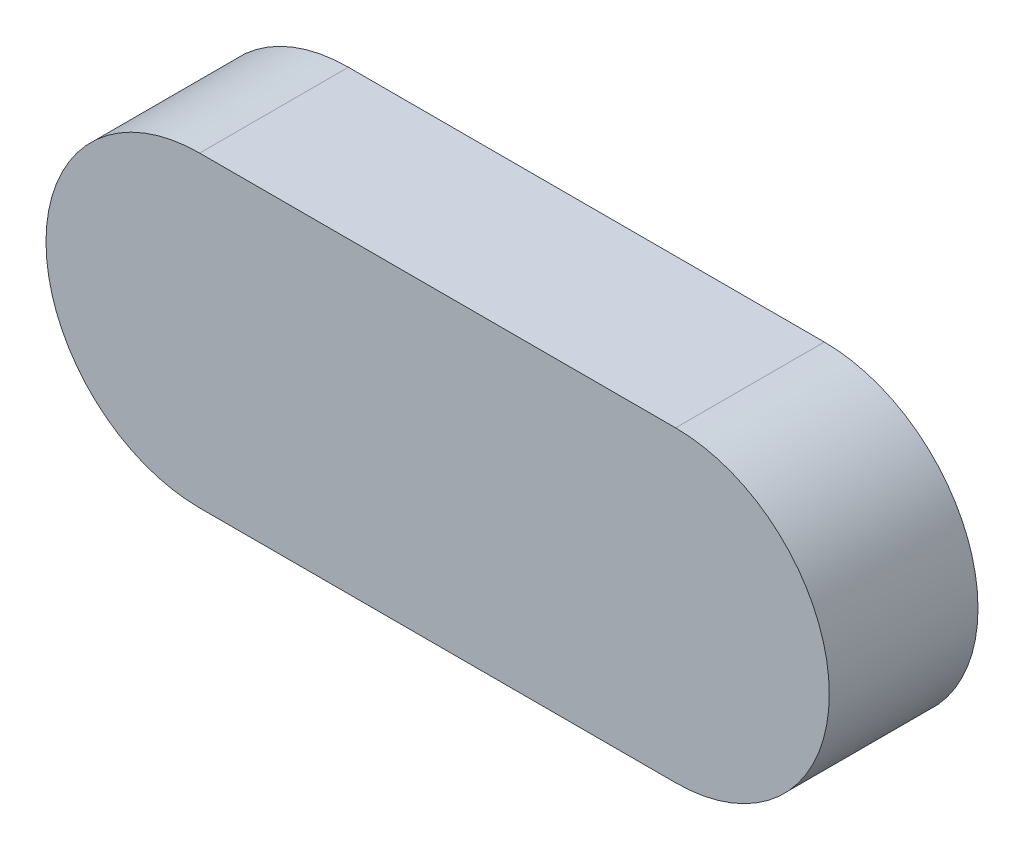
ISO-10303-21;
HEADER;
FILE_DESCRIPTION(('STEP AP214'),'2;1');
FILE_NAME('part.step','',(''),(''),'','','');
FILE_SCHEMA(('AUTOMOTIVE_DESIGN { 1 0 10303 214 1 1 1 1 }'));
ENDSEC;
DATA;
#1=APPLICATION_CONTEXT('core data for automotive mechanical design processes');
#2=APPLICATION_PROTOCOL_DEFINITION('international standard','automotive_design',2000,#1);
#3=PRODUCT_CONTEXT('',#1,'mechanical');
#4=PRODUCT('Part','Part','',(#3));
#5=PRODUCT_RELATED_PRODUCT_CATEGORY('part','',(#4));
#6=PRODUCT_DEFINITION_FORMATION('','',#4);
#7=PRODUCT_DEFINITION_CONTEXT('part definition',#1,'design');
#8=PRODUCT_DEFINITION('design','',#6,#7);
#9=PRODUCT_DEFINITION_SHAPE('','',#8);
#10=(LENGTH_UNIT() NAMED_UNIT(*) SI_UNIT(.MILLI.,.METRE.));
#11=(NAMED_UNIT(*) PLANE_ANGLE_UNIT() SI_UNIT($,.RADIAN.));
#12=(NAMED_UNIT(*) SI_UNIT($,.STERADIAN.) SOLID_ANGLE_UNIT());
#13=UNCERTAINTY_MEASURE_WITH_UNIT(LENGTH_MEASURE(1.E-05),#10,'distance_accuracy_value','');
#14=(GEOMETRIC_REPRESENTATION_CONTEXT(3) GLOBAL_UNCERTAINTY_ASSIGNED_CONTEXT((#13)) GLOBAL_UNIT_ASSIGNED_CONTEXT((#10,
#11,#12)) REPRESENTATION_CONTEXT('',''));
#15=CARTESIAN_POINT('',(0.,0.,0.));
#16=DIRECTION('',(0.,0.,1.));
#17=DIRECTION('',(1.,0.,0.));
#18=AXIS2_PLACEMENT_3D('',#15,#16,#17);
#19=CARTESIAN_POINT('',(-12.,0.,3.75));
#20=DIRECTION('',(0.,0.,-1.));
#21=DIRECTION('',(-1.,0.,0.));
#22=AXIS2_PLACEMENT_3D('',#19,#20,#21);
#23=CYLINDRICAL_SURFACE('',#22,7.75);
#24=CARTESIAN_POINT('',(-12.,0.,-3.75));
#25=DIRECTION('',(0.,0.,1.));
#26=DIRECTION('',(1.,0.,0.));
#27=AXIS2_PLACEMENT_3D('',#24,#25,#26);
#28=CIRCLE('',#27,7.75);
#29=CARTESIAN_POINT('',(-12.,7.75,-3.75));
#30=VERTEX_POINT('',#29);
#31=CARTESIAN_POINT('',(-12.,-7.75,-3.75));
#32=VERTEX_POINT('',#31);
#33=EDGE_CURVE('E102',#30,#32,#28,.T.);
#34=ORIENTED_EDGE('',*,*,#33,.T.);
#35=DIRECTION('',(0.,0.,-1.));
#36=VECTOR('',#35,1.);
#37=CARTESIAN_POINT('',(-12.,-7.75,3.75));
#38=LINE('',#37,#36);
#39=CARTESIAN_POINT('',(-12.,-7.75,3.75));
#40=VERTEX_POINT('',#39);
#41=EDGE_CURVE('E11',#40,#32,#38,.T.);
#42=ORIENTED_EDGE('',*,*,#41,.F.);
#43=CARTESIAN_POINT('',(-12.,0.,3.75));
#44=DIRECTION('',(0.,0.,1.));
#45=DIRECTION('',(1.,0.,0.));
#46=AXIS2_PLACEMENT_3D('',#43,#44,#45);
#47=CIRCLE('',#46,7.75);
#48=CARTESIAN_POINT('',(-12.,7.75,3.75));
#49=VERTEX_POINT('',#48);
#50=EDGE_CURVE('E90',#49,#40,#47,.T.);
#51=ORIENTED_EDGE('',*,*,#50,.F.);
#52=DIRECTION('',(0.,0.,-1.));
#53=VECTOR('',#52,1.);
#54=CARTESIAN_POINT('',(-12.,7.75,3.75));
#55=LINE('',#54,#53);
#56=EDGE_CURVE('E98',#49,#30,#55,.T.);
#57=ORIENTED_EDGE('',*,*,#56,.T.);
#58=EDGE_LOOP('',(#34,#42,#51,#57));
#59=FACE_BOUND('',#58,.T.);
#60=ADVANCED_FACE('F39',(#59),#23,.T.);
#61=CARTESIAN_POINT('',(-12.,-7.75,3.75));
#62=DIRECTION('',(0.,1.,0.));
#63=DIRECTION('',(-1.,0.,0.));
#64=AXIS2_PLACEMENT_3D('',#61,#62,#63);
#65=PLANE('',#64);
#66=DIRECTION('',(1.,0.,0.));
#67=VECTOR('',#66,1.);
#68=CARTESIAN_POINT('',(-12.,-7.75,-3.75));
#69=LINE('',#68,#67);
#70=CARTESIAN_POINT('',(12.,-7.75,-3.75));
#71=VERTEX_POINT('',#70);
#72=EDGE_CURVE('E94',#32,#71,#69,.T.);
#73=ORIENTED_EDGE('',*,*,#72,.T.);
#74=DIRECTION('',(0.,0.,-1.));
#75=VECTOR('',#74,1.);
#76=CARTESIAN_POINT('',(12.,-7.75,3.75));
#77=LINE('',#76,#75);
#78=CARTESIAN_POINT('',(12.,-7.75,3.75));
#79=VERTEX_POINT('',#78);
#80=EDGE_CURVE('E47',#79,#71,#77,.T.);
#81=ORIENTED_EDGE('',*,*,#80,.F.);
#82=DIRECTION('',(1.,0.,0.));
#83=VECTOR('',#82,1.);
#84=CARTESIAN_POINT('',(-12.,-7.75,3.75));
#85=LINE('',#84,#83);
#86=EDGE_CURVE('E85',#40,#79,#85,.T.);
#87=ORIENTED_EDGE('',*,*,#86,.F.);
#88=ORIENTED_EDGE('',*,*,#41,.T.);
#89=EDGE_LOOP('',(#73,#81,#87,#88));
#90=FACE_BOUND('',#89,.T.);
#91=ADVANCED_FACE('F93',(#90),#65,.F.);
#92=CARTESIAN_POINT('',(12.,0.,3.75));
#93=DIRECTION('',(0.,0.,-1.));
#94=DIRECTION('',(-1.,0.,0.));
#95=AXIS2_PLACEMENT_3D('',#92,#93,#94);
#96=CYLINDRICAL_SURFACE('',#95,7.75);
#97=CARTESIAN_POINT('',(12.,0.,-3.75));
#98=DIRECTION('',(0.,0.,1.));
#99=DIRECTION('',(1.,0.,0.));
#100=AXIS2_PLACEMENT_3D('',#97,#98,#99);
#101=CIRCLE('',#100,7.75);
#102=CARTESIAN_POINT('',(12.,7.75000000000001,-3.75));
#103=VERTEX_POINT('',#102);
#104=EDGE_CURVE('E72',#71,#103,#101,.T.);
#105=ORIENTED_EDGE('',*,*,#104,.T.);
#106=DIRECTION('',(0.,0.,-1.));
#107=VECTOR('',#106,1.);
#108=CARTESIAN_POINT('',(12.,7.75000000000001,3.75));
#109=LINE('',#108,#107);
#110=CARTESIAN_POINT('',(12.,7.75000000000001,3.75));
#111=VERTEX_POINT('',#110);
#112=EDGE_CURVE('E95',#111,#103,#109,.T.);
#113=ORIENTED_EDGE('',*,*,#112,.F.);
#114=CARTESIAN_POINT('',(12.,0.,3.75));
#115=DIRECTION('',(0.,0.,1.));
#116=DIRECTION('',(1.,0.,0.));
#117=AXIS2_PLACEMENT_3D('',#114,#115,#116);
#118=CIRCLE('',#117,7.75);
#119=EDGE_CURVE('E88',#79,#111,#118,.T.);
#120=ORIENTED_EDGE('',*,*,#119,.F.);
#121=ORIENTED_EDGE('',*,*,#80,.T.);
#122=EDGE_LOOP('',(#105,#113,#120,#121));
#123=FACE_BOUND('',#122,.T.);
#124=ADVANCED_FACE('F96',(#123),#96,.T.);
#125=CARTESIAN_POINT('',(-12.,7.75,3.75));
#126=DIRECTION('',(0.,-1.,0.));
#127=DIRECTION('',(1.,0.,0.));
#128=AXIS2_PLACEMENT_3D('',#125,#126,#127);
#129=PLANE('',#128);
#130=DIRECTION('',(-1.,0.,0.));
#131=VECTOR('',#130,1.);
#132=CARTESIAN_POINT('',(-12.,7.75,-3.75));
#133=LINE('',#132,#131);
#134=EDGE_CURVE('E78',#103,#30,#133,.T.);
#135=ORIENTED_EDGE('',*,*,#134,.T.);
#136=ORIENTED_EDGE('',*,*,#56,.F.);
#137=DIRECTION('',(-1.,0.,0.));
#138=VECTOR('',#137,1.);
#139=CARTESIAN_POINT('',(-12.,7.75,3.75));
#140=LINE('',#139,#138);
#141=EDGE_CURVE('E55',#111,#49,#140,.T.);
#142=ORIENTED_EDGE('',*,*,#141,.F.);
#143=ORIENTED_EDGE('',*,*,#112,.T.);
#144=EDGE_LOOP('',(#135,#136,#142,#143));
#145=FACE_BOUND('',#144,.T.);
#146=ADVANCED_FACE('F109',(#145),#129,.F.);
#147=CARTESIAN_POINT('',(-12.,0.,3.75));
#148=DIRECTION('',(0.,0.,1.));
#149=DIRECTION('',(1.,0.,0.));
#150=AXIS2_PLACEMENT_3D('',#147,#148,#149);
#151=PLANE('',#150);
#152=ORIENTED_EDGE('',*,*,#50,.T.);
#153=ORIENTED_EDGE('',*,*,#86,.T.);
#154=ORIENTED_EDGE('',*,*,#119,.T.);
#155=ORIENTED_EDGE('',*,*,#141,.T.);
#156=EDGE_LOOP('',(#152,#153,#154,#155));
#157=FACE_BOUND('',#156,.T.);
#158=ADVANCED_FACE('F86',(#157),#151,.T.);
#159=CARTESIAN_POINT('',(-12.,0.,-3.75));
#160=DIRECTION('',(0.,0.,1.));
#161=DIRECTION('',(1.,0.,0.));
#162=AXIS2_PLACEMENT_3D('',#159,#160,#161);
#163=PLANE('',#162);
#164=ORIENTED_EDGE('',*,*,#33,.F.);
#165=ORIENTED_EDGE('',*,*,#134,.F.);
#166=ORIENTED_EDGE('',*,*,#104,.F.);
#167=ORIENTED_EDGE('',*,*,#72,.F.);
#168=EDGE_LOOP('',(#164,#165,#166,#167));
#169=FACE_BOUND('',#168,.T.);
#170=ADVANCED_FACE('F112',(#169),#163,.F.);
#171=CLOSED_SHELL('',(#60,#91,#124,#146,#158,#170));
#172=MANIFOLD_SOLID_BREP('B2',#171);
#173=ADVANCED_BREP_SHAPE_REPRESENTATION('',(#18,#172),#14);
#174=SHAPE_DEFINITION_REPRESENTATION(#9,#173);
ENDSEC;
END-ISO-10303-21;
